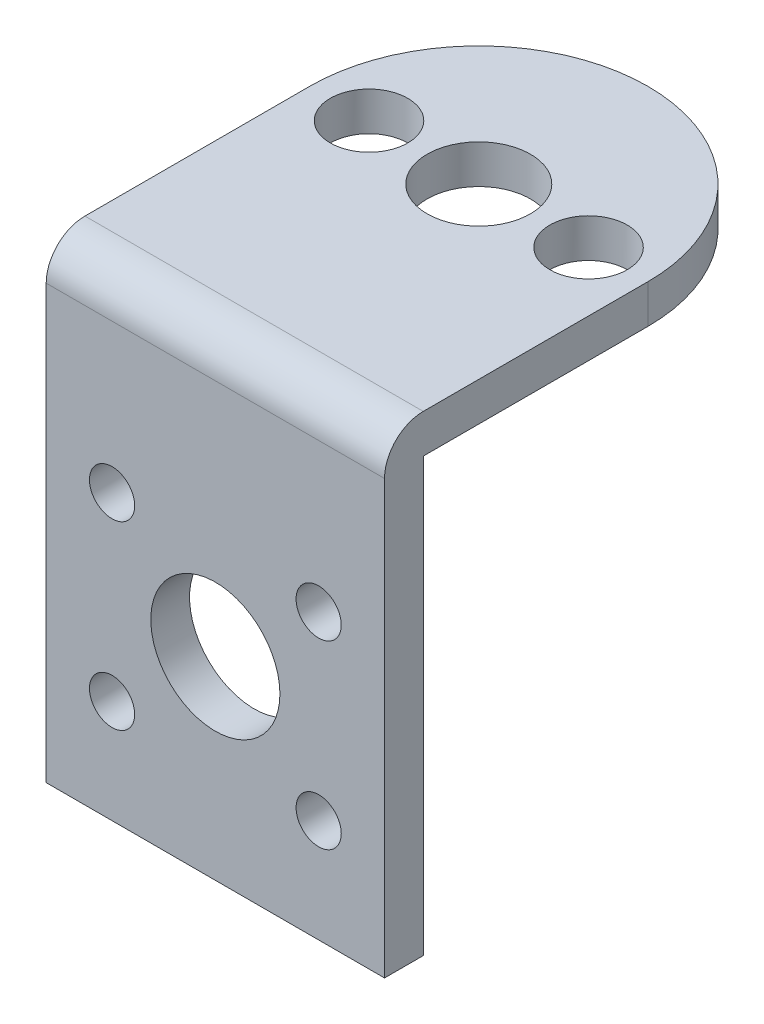
ISO-10303-21;
HEADER;
FILE_DESCRIPTION(('STEP AP214'),'2;1');
FILE_NAME('part.step','',(''),(''),'','','');
FILE_SCHEMA(('AUTOMOTIVE_DESIGN { 1 0 10303 214 1 1 1 1 }'));
ENDSEC;
DATA;
#1=APPLICATION_CONTEXT('core data for automotive mechanical design processes');
#2=APPLICATION_PROTOCOL_DEFINITION('international standard','automotive_design',2000,#1);
#3=PRODUCT_CONTEXT('',#1,'mechanical');
#4=PRODUCT('Part','Part','',(#3));
#5=PRODUCT_RELATED_PRODUCT_CATEGORY('part','',(#4));
#6=PRODUCT_DEFINITION_FORMATION('','',#4);
#7=PRODUCT_DEFINITION_CONTEXT('part definition',#1,'design');
#8=PRODUCT_DEFINITION('design','',#6,#7);
#9=PRODUCT_DEFINITION_SHAPE('','',#8);
#10=(LENGTH_UNIT() NAMED_UNIT(*) SI_UNIT(.MILLI.,.METRE.));
#11=(NAMED_UNIT(*) PLANE_ANGLE_UNIT() SI_UNIT($,.RADIAN.));
#12=(NAMED_UNIT(*) SI_UNIT($,.STERADIAN.) SOLID_ANGLE_UNIT());
#13=UNCERTAINTY_MEASURE_WITH_UNIT(LENGTH_MEASURE(1.E-05),#10,'distance_accuracy_value','');
#14=(GEOMETRIC_REPRESENTATION_CONTEXT(3) GLOBAL_UNCERTAINTY_ASSIGNED_CONTEXT((#13)) GLOBAL_UNIT_ASSIGNED_CONTEXT((#10,
#11,#12)) REPRESENTATION_CONTEXT('',''));
#15=CARTESIAN_POINT('',(0.,0.,0.));
#16=DIRECTION('',(0.,0.,1.));
#17=DIRECTION('',(1.,0.,0.));
#18=AXIS2_PLACEMENT_3D('',#15,#16,#17);
#19=CARTESIAN_POINT('',(0.,-3.,-20.4));
#20=DIRECTION('',(0.,-1.,0.));
#21=DIRECTION('',(0.,0.,-1.));
#22=AXIS2_PLACEMENT_3D('',#19,#20,#21);
#23=PLANE('',#22);
#24=CARTESIAN_POINT('',(-8.5,-3.,-20.4));
#25=DIRECTION('',(0.,-1.,0.));
#26=DIRECTION('',(0.,0.,-1.));
#27=AXIS2_PLACEMENT_3D('',#24,#25,#26);
#28=CIRCLE('',#27,3.);
#29=CARTESIAN_POINT('',(-8.5,-3.,-23.4));
#30=VERTEX_POINT('',#29);
#31=EDGE_CURVE('E338',#30,#30,#28,.F.);
#32=ORIENTED_EDGE('',*,*,#31,.T.);
#33=EDGE_LOOP('',(#32));
#34=FACE_BOUND('',#33,.T.);
#35=CARTESIAN_POINT('',(8.5,-3.,-20.4));
#36=DIRECTION('',(0.,-1.,0.));
#37=DIRECTION('',(0.,0.,-1.));
#38=AXIS2_PLACEMENT_3D('',#35,#36,#37);
#39=CIRCLE('',#38,3.);
#40=CARTESIAN_POINT('',(8.5,-3.,-23.4));
#41=VERTEX_POINT('',#40);
#42=EDGE_CURVE('E348',#41,#41,#39,.T.);
#43=ORIENTED_EDGE('',*,*,#42,.F.);
#44=EDGE_LOOP('',(#43));
#45=FACE_BOUND('',#44,.T.);
#46=CARTESIAN_POINT('',(0.,-3.,-20.4));
#47=DIRECTION('',(0.,1.,0.));
#48=DIRECTION('',(0.,0.,1.));
#49=AXIS2_PLACEMENT_3D('',#46,#47,#48);
#50=CIRCLE('',#49,4.);
#51=CARTESIAN_POINT('',(0.,-3.,-16.4));
#52=VERTEX_POINT('',#51);
#53=EDGE_CURVE('E132',#52,#52,#50,.T.);
#54=ORIENTED_EDGE('',*,*,#53,.T.);
#55=EDGE_LOOP('',(#54));
#56=FACE_BOUND('',#55,.T.);
#57=DIRECTION('',(0.,0.,-1.));
#58=VECTOR('',#57,1.);
#59=CARTESIAN_POINT('',(13.1,-3.,0.));
#60=LINE('',#59,#58);
#61=CARTESIAN_POINT('',(13.1,-3.,-3.));
#62=VERTEX_POINT('',#61);
#63=CARTESIAN_POINT('',(13.1,-3.,-20.4));
#64=VERTEX_POINT('',#63);
#65=EDGE_CURVE('E138',#62,#64,#60,.T.);
#66=ORIENTED_EDGE('',*,*,#65,.F.);
#67=DIRECTION('',(-1.,0.,0.));
#68=VECTOR('',#67,1.);
#69=CARTESIAN_POINT('',(-13.1,-3.,-3.));
#70=LINE('',#69,#68);
#71=CARTESIAN_POINT('',(-13.1,-3.,-3.));
#72=VERTEX_POINT('',#71);
#73=EDGE_CURVE('E122',#62,#72,#70,.T.);
#74=ORIENTED_EDGE('',*,*,#73,.T.);
#75=DIRECTION('',(0.,0.,1.));
#76=VECTOR('',#75,1.);
#77=CARTESIAN_POINT('',(-13.1,-3.,0.));
#78=LINE('',#77,#76);
#79=CARTESIAN_POINT('',(-13.1,-3.,-20.4));
#80=VERTEX_POINT('',#79);
#81=EDGE_CURVE('E121',#80,#72,#78,.T.);
#82=ORIENTED_EDGE('',*,*,#81,.F.);
#83=CARTESIAN_POINT('',(0.,-3.,-20.4));
#84=DIRECTION('',(0.,1.,0.));
#85=DIRECTION('',(0.,0.,-1.));
#86=AXIS2_PLACEMENT_3D('',#83,#84,#85);
#87=CIRCLE('',#86,13.1);
#88=EDGE_CURVE('E140',#64,#80,#87,.T.);
#89=ORIENTED_EDGE('',*,*,#88,.F.);
#90=EDGE_LOOP('',(#66,#74,#82,#89));
#91=FACE_BOUND('',#90,.T.);
#92=ADVANCED_FACE('F41',(#34,#45,#56,#91),#23,.T.);
#93=CARTESIAN_POINT('',(0.,-3.,0.));
#94=DIRECTION('',(0.,0.,1.));
#95=DIRECTION('',(1.,0.,0.));
#96=AXIS2_PLACEMENT_3D('',#93,#94,#95);
#97=PLANE('',#96);
#98=DIRECTION('',(0.,1.,0.));
#99=VECTOR('',#98,1.);
#100=CARTESIAN_POINT('',(13.1,-3.,0.));
#101=LINE('',#100,#99);
#102=CARTESIAN_POINT('',(13.1,-36.5,0.));
#103=VERTEX_POINT('',#102);
#104=CARTESIAN_POINT('',(13.1,-3.,0.));
#105=VERTEX_POINT('',#104);
#106=EDGE_CURVE('E145',#103,#105,#101,.T.);
#107=ORIENTED_EDGE('',*,*,#106,.T.);
#108=DIRECTION('',(1.,0.,0.));
#109=VECTOR('',#108,1.);
#110=CARTESIAN_POINT('',(-13.1,-3.,0.));
#111=LINE('',#110,#109);
#112=CARTESIAN_POINT('',(-13.1,-3.,0.));
#113=VERTEX_POINT('',#112);
#114=EDGE_CURVE('E49',#105,#113,#111,.F.);
#115=ORIENTED_EDGE('',*,*,#114,.T.);
#116=DIRECTION('',(0.,1.,0.));
#117=VECTOR('',#116,1.);
#118=CARTESIAN_POINT('',(-13.1,-3.,0.));
#119=LINE('',#118,#117);
#120=CARTESIAN_POINT('',(-13.1,-36.5,0.));
#121=VERTEX_POINT('',#120);
#122=EDGE_CURVE('E152',#121,#113,#119,.T.);
#123=ORIENTED_EDGE('',*,*,#122,.F.);
#124=DIRECTION('',(1.,0.,0.));
#125=VECTOR('',#124,1.);
#126=CARTESIAN_POINT('',(13.1,-36.5,0.));
#127=LINE('',#126,#125);
#128=EDGE_CURVE('E106',#121,#103,#127,.T.);
#129=ORIENTED_EDGE('',*,*,#128,.T.);
#130=EDGE_LOOP('',(#107,#115,#123,#129));
#131=FACE_BOUND('',#130,.T.);
#132=CARTESIAN_POINT('',(-8.,-28.5,0.));
#133=DIRECTION('',(0.,0.,1.));
#134=DIRECTION('',(-1.,0.,0.));
#135=AXIS2_PLACEMENT_3D('',#132,#133,#134);
#136=CIRCLE('',#135,1.75);
#137=CARTESIAN_POINT('',(-9.75,-28.5,0.));
#138=VERTEX_POINT('',#137);
#139=EDGE_CURVE('E351',#138,#138,#136,.T.);
#140=ORIENTED_EDGE('',*,*,#139,.F.);
#141=EDGE_LOOP('',(#140));
#142=FACE_BOUND('',#141,.T.);
#143=CARTESIAN_POINT('',(8.,-14.5,0.));
#144=DIRECTION('',(0.,0.,1.));
#145=DIRECTION('',(1.,0.,0.));
#146=AXIS2_PLACEMENT_3D('',#143,#144,#145);
#147=CIRCLE('',#146,1.75);
#148=CARTESIAN_POINT('',(9.75,-14.5,0.));
#149=VERTEX_POINT('',#148);
#150=EDGE_CURVE('E355',#149,#149,#147,.T.);
#151=ORIENTED_EDGE('',*,*,#150,.F.);
#152=EDGE_LOOP('',(#151));
#153=FACE_BOUND('',#152,.T.);
#154=CARTESIAN_POINT('',(8.,-28.5,0.));
#155=DIRECTION('',(0.,0.,1.));
#156=DIRECTION('',(1.,0.,0.));
#157=AXIS2_PLACEMENT_3D('',#154,#155,#156);
#158=CIRCLE('',#157,1.75);
#159=CARTESIAN_POINT('',(9.75,-28.5,0.));
#160=VERTEX_POINT('',#159);
#161=EDGE_CURVE('E361',#160,#160,#158,.T.);
#162=ORIENTED_EDGE('',*,*,#161,.F.);
#163=EDGE_LOOP('',(#162));
#164=FACE_BOUND('',#163,.T.);
#165=CARTESIAN_POINT('',(0.,-21.5,0.));
#166=DIRECTION('',(0.,0.,1.));
#167=DIRECTION('',(1.,0.,0.));
#168=AXIS2_PLACEMENT_3D('',#165,#166,#167);
#169=CIRCLE('',#168,5.);
#170=CARTESIAN_POINT('',(5.,-21.5,0.));
#171=VERTEX_POINT('',#170);
#172=EDGE_CURVE('E367',#171,#171,#169,.T.);
#173=ORIENTED_EDGE('',*,*,#172,.F.);
#174=EDGE_LOOP('',(#173));
#175=FACE_BOUND('',#174,.T.);
#176=CARTESIAN_POINT('',(-8.,-14.5,0.));
#177=DIRECTION('',(0.,0.,1.));
#178=DIRECTION('',(-1.,0.,0.));
#179=AXIS2_PLACEMENT_3D('',#176,#177,#178);
#180=CIRCLE('',#179,1.75);
#181=CARTESIAN_POINT('',(-9.75,-14.5,0.));
#182=VERTEX_POINT('',#181);
#183=EDGE_CURVE('E373',#182,#182,#180,.T.);
#184=ORIENTED_EDGE('',*,*,#183,.F.);
#185=EDGE_LOOP('',(#184));
#186=FACE_BOUND('',#185,.T.);
#187=ADVANCED_FACE('F191',(#131,#142,#153,#164,#175,#186),#97,.T.);
#188=CARTESIAN_POINT('',(-13.1,-3.,0.));
#189=DIRECTION('',(-1.,0.,0.));
#190=DIRECTION('',(0.,0.,1.));
#191=AXIS2_PLACEMENT_3D('',#188,#189,#190);
#192=PLANE('',#191);
#193=ORIENTED_EDGE('',*,*,#122,.T.);
#194=CARTESIAN_POINT('',(-13.1,-3.,-3.));
#195=DIRECTION('',(-1.,0.,0.));
#196=DIRECTION('',(0.,0.,1.));
#197=AXIS2_PLACEMENT_3D('',#194,#195,#196);
#198=CIRCLE('',#197,3.);
#199=CARTESIAN_POINT('',(-13.1,0.,-3.));
#200=VERTEX_POINT('',#199);
#201=EDGE_CURVE('E11',#113,#200,#198,.T.);
#202=ORIENTED_EDGE('',*,*,#201,.T.);
#203=DIRECTION('',(0.,0.,1.));
#204=VECTOR('',#203,1.);
#205=CARTESIAN_POINT('',(-13.1,0.,0.));
#206=LINE('',#205,#204);
#207=CARTESIAN_POINT('',(-13.1,0.,-20.4));
#208=VERTEX_POINT('',#207);
#209=EDGE_CURVE('E141',#208,#200,#206,.T.);
#210=ORIENTED_EDGE('',*,*,#209,.F.);
#211=DIRECTION('',(0.,1.,0.));
#212=VECTOR('',#211,1.);
#213=CARTESIAN_POINT('',(-13.1,-3.,-20.4));
#214=LINE('',#213,#212);
#215=EDGE_CURVE('E155',#80,#208,#214,.T.);
#216=ORIENTED_EDGE('',*,*,#215,.F.);
#217=ORIENTED_EDGE('',*,*,#81,.T.);
#218=DIRECTION('',(0.,-1.,0.));
#219=VECTOR('',#218,1.);
#220=CARTESIAN_POINT('',(-13.1,-36.5,-3.));
#221=LINE('',#220,#219);
#222=CARTESIAN_POINT('',(-13.1,-36.5,-3.));
#223=VERTEX_POINT('',#222);
#224=EDGE_CURVE('E114',#72,#223,#221,.T.);
#225=ORIENTED_EDGE('',*,*,#224,.T.);
#226=DIRECTION('',(0.,0.,1.));
#227=VECTOR('',#226,1.);
#228=CARTESIAN_POINT('',(-13.1,-36.5,-3.));
#229=LINE('',#228,#227);
#230=EDGE_CURVE('E99',#223,#121,#229,.T.);
#231=ORIENTED_EDGE('',*,*,#230,.T.);
#232=EDGE_LOOP('',(#193,#202,#210,#216,#217,#225,#231));
#233=FACE_BOUND('',#232,.T.);
#234=ADVANCED_FACE('F119',(#233),#192,.T.);
#235=CARTESIAN_POINT('',(0.,-3.,-20.4));
#236=DIRECTION('',(0.,1.,0.));
#237=DIRECTION('',(0.,0.,1.));
#238=AXIS2_PLACEMENT_3D('',#235,#236,#237);
#239=CYLINDRICAL_SURFACE('',#238,13.1);
#240=CARTESIAN_POINT('',(0.,0.,-20.4));
#241=DIRECTION('',(0.,1.,0.));
#242=DIRECTION('',(0.,0.,-1.));
#243=AXIS2_PLACEMENT_3D('',#240,#241,#242);
#244=CIRCLE('',#243,13.1);
#245=CARTESIAN_POINT('',(13.1,0.,-20.4));
#246=VERTEX_POINT('',#245);
#247=EDGE_CURVE('E147',#246,#208,#244,.T.);
#248=ORIENTED_EDGE('',*,*,#247,.F.);
#249=DIRECTION('',(0.,1.,0.));
#250=VECTOR('',#249,1.);
#251=CARTESIAN_POINT('',(13.1,-3.,-20.4));
#252=LINE('',#251,#250);
#253=EDGE_CURVE('E157',#64,#246,#252,.T.);
#254=ORIENTED_EDGE('',*,*,#253,.F.);
#255=ORIENTED_EDGE('',*,*,#88,.T.);
#256=ORIENTED_EDGE('',*,*,#215,.T.);
#257=EDGE_LOOP('',(#248,#254,#255,#256));
#258=FACE_BOUND('',#257,.T.);
#259=ADVANCED_FACE('F175',(#258),#239,.T.);
#260=CARTESIAN_POINT('',(13.1,-3.,0.));
#261=DIRECTION('',(1.,0.,0.));
#262=DIRECTION('',(0.,0.,-1.));
#263=AXIS2_PLACEMENT_3D('',#260,#261,#262);
#264=PLANE('',#263);
#265=DIRECTION('',(0.,0.,-1.));
#266=VECTOR('',#265,1.);
#267=CARTESIAN_POINT('',(13.1,0.,0.));
#268=LINE('',#267,#266);
#269=CARTESIAN_POINT('',(13.1,0.,-3.));
#270=VERTEX_POINT('',#269);
#271=EDGE_CURVE('E135',#270,#246,#268,.T.);
#272=ORIENTED_EDGE('',*,*,#271,.F.);
#273=CARTESIAN_POINT('',(13.1,-3.,-3.));
#274=DIRECTION('',(1.,0.,0.));
#275=DIRECTION('',(0.,0.,-1.));
#276=AXIS2_PLACEMENT_3D('',#273,#274,#275);
#277=CIRCLE('',#276,3.);
#278=EDGE_CURVE('E63',#270,#105,#277,.T.);
#279=ORIENTED_EDGE('',*,*,#278,.T.);
#280=ORIENTED_EDGE('',*,*,#106,.F.);
#281=DIRECTION('',(0.,0.,1.));
#282=VECTOR('',#281,1.);
#283=CARTESIAN_POINT('',(13.1,-36.5,-3.));
#284=LINE('',#283,#282);
#285=CARTESIAN_POINT('',(13.1,-36.5,-3.));
#286=VERTEX_POINT('',#285);
#287=EDGE_CURVE('E109',#286,#103,#284,.T.);
#288=ORIENTED_EDGE('',*,*,#287,.F.);
#289=DIRECTION('',(0.,1.,0.));
#290=VECTOR('',#289,1.);
#291=CARTESIAN_POINT('',(13.1,-3.,-3.));
#292=LINE('',#291,#290);
#293=EDGE_CURVE('E110',#286,#62,#292,.T.);
#294=ORIENTED_EDGE('',*,*,#293,.T.);
#295=ORIENTED_EDGE('',*,*,#65,.T.);
#296=ORIENTED_EDGE('',*,*,#253,.T.);
#297=EDGE_LOOP('',(#272,#279,#280,#288,#294,#295,#296));
#298=FACE_BOUND('',#297,.T.);
#299=ADVANCED_FACE('F169',(#298),#264,.T.);
#300=CARTESIAN_POINT('',(0.,0.,-20.4));
#301=DIRECTION('',(0.,-1.,0.));
#302=DIRECTION('',(0.,0.,-1.));
#303=AXIS2_PLACEMENT_3D('',#300,#301,#302);
#304=PLANE('',#303);
#305=CARTESIAN_POINT('',(-8.5,0.,-20.4));
#306=DIRECTION('',(0.,-1.,0.));
#307=DIRECTION('',(0.,0.,1.));
#308=AXIS2_PLACEMENT_3D('',#305,#306,#307);
#309=CIRCLE('',#308,3.);
#310=CARTESIAN_POINT('',(-8.5,0.,-17.4));
#311=VERTEX_POINT('',#310);
#312=EDGE_CURVE('E341',#311,#311,#309,.T.);
#313=ORIENTED_EDGE('',*,*,#312,.T.);
#314=EDGE_LOOP('',(#313));
#315=FACE_BOUND('',#314,.T.);
#316=CARTESIAN_POINT('',(8.5,0.,-20.4));
#317=DIRECTION('',(0.,1.,0.));
#318=DIRECTION('',(0.,0.,1.));
#319=AXIS2_PLACEMENT_3D('',#316,#317,#318);
#320=CIRCLE('',#319,3.);
#321=CARTESIAN_POINT('',(8.5,0.,-17.4));
#322=VERTEX_POINT('',#321);
#323=EDGE_CURVE('E343',#322,#322,#320,.T.);
#324=ORIENTED_EDGE('',*,*,#323,.F.);
#325=EDGE_LOOP('',(#324));
#326=FACE_BOUND('',#325,.T.);
#327=CARTESIAN_POINT('',(0.,0.,-20.4));
#328=DIRECTION('',(0.,1.,0.));
#329=DIRECTION('',(0.,0.,1.));
#330=AXIS2_PLACEMENT_3D('',#327,#328,#329);
#331=CIRCLE('',#330,4.);
#332=CARTESIAN_POINT('',(0.,0.,-16.4));
#333=VERTEX_POINT('',#332);
#334=EDGE_CURVE('E130',#333,#333,#331,.T.);
#335=ORIENTED_EDGE('',*,*,#334,.F.);
#336=EDGE_LOOP('',(#335));
#337=FACE_BOUND('',#336,.T.);
#338=ORIENTED_EDGE('',*,*,#209,.T.);
#339=DIRECTION('',(1.,0.,0.));
#340=VECTOR('',#339,1.);
#341=CARTESIAN_POINT('',(13.1,0.,-3.));
#342=LINE('',#341,#340);
#343=EDGE_CURVE('E154',#200,#270,#342,.T.);
#344=ORIENTED_EDGE('',*,*,#343,.T.);
#345=ORIENTED_EDGE('',*,*,#271,.T.);
#346=ORIENTED_EDGE('',*,*,#247,.T.);
#347=EDGE_LOOP('',(#338,#344,#345,#346));
#348=FACE_BOUND('',#347,.T.);
#349=ADVANCED_FACE('F165',(#315,#326,#337,#348),#304,.F.);
#350=CARTESIAN_POINT('',(0.,-3.,-20.4));
#351=DIRECTION('',(0.,1.,0.));
#352=DIRECTION('',(0.,0.,1.));
#353=AXIS2_PLACEMENT_3D('',#350,#351,#352);
#354=CYLINDRICAL_SURFACE('',#353,4.);
#355=ORIENTED_EDGE('',*,*,#53,.F.);
#356=EDGE_LOOP('',(#355));
#357=FACE_BOUND('',#356,.T.);
#358=ORIENTED_EDGE('',*,*,#334,.T.);
#359=EDGE_LOOP('',(#358));
#360=FACE_BOUND('',#359,.T.);
#361=ADVANCED_FACE('F203',(#357,#360),#354,.F.);
#362=CARTESIAN_POINT('',(13.1,-36.5,-3.));
#363=DIRECTION('',(0.,-1.,0.));
#364=DIRECTION('',(0.,0.,-1.));
#365=AXIS2_PLACEMENT_3D('',#362,#363,#364);
#366=PLANE('',#365);
#367=ORIENTED_EDGE('',*,*,#128,.F.);
#368=ORIENTED_EDGE('',*,*,#230,.F.);
#369=DIRECTION('',(1.,0.,0.));
#370=VECTOR('',#369,1.);
#371=CARTESIAN_POINT('',(13.1,-36.5,-3.));
#372=LINE('',#371,#370);
#373=EDGE_CURVE('E103',#223,#286,#372,.T.);
#374=ORIENTED_EDGE('',*,*,#373,.T.);
#375=ORIENTED_EDGE('',*,*,#287,.T.);
#376=EDGE_LOOP('',(#367,#368,#374,#375));
#377=FACE_BOUND('',#376,.T.);
#378=ADVANCED_FACE('F101',(#377),#366,.T.);
#379=CARTESIAN_POINT('',(0.,0.,-3.));
#380=DIRECTION('',(0.,0.,-1.));
#381=DIRECTION('',(-1.,0.,0.));
#382=AXIS2_PLACEMENT_3D('',#379,#380,#381);
#383=PLANE('',#382);
#384=CARTESIAN_POINT('',(-8.,-28.5,-3.));
#385=DIRECTION('',(0.,0.,1.));
#386=DIRECTION('',(-1.,0.,0.));
#387=AXIS2_PLACEMENT_3D('',#384,#385,#386);
#388=CIRCLE('',#387,1.75);
#389=CARTESIAN_POINT('',(-9.75,-28.5,-3.));
#390=VERTEX_POINT('',#389);
#391=EDGE_CURVE('E352',#390,#390,#388,.T.);
#392=ORIENTED_EDGE('',*,*,#391,.T.);
#393=EDGE_LOOP('',(#392));
#394=FACE_BOUND('',#393,.T.);
#395=CARTESIAN_POINT('',(8.,-14.5,-3.));
#396=DIRECTION('',(0.,0.,1.));
#397=DIRECTION('',(1.,0.,0.));
#398=AXIS2_PLACEMENT_3D('',#395,#396,#397);
#399=CIRCLE('',#398,1.75);
#400=CARTESIAN_POINT('',(9.75,-14.5,-3.));
#401=VERTEX_POINT('',#400);
#402=EDGE_CURVE('E358',#401,#401,#399,.T.);
#403=ORIENTED_EDGE('',*,*,#402,.T.);
#404=EDGE_LOOP('',(#403));
#405=FACE_BOUND('',#404,.T.);
#406=CARTESIAN_POINT('',(8.,-28.5,-3.));
#407=DIRECTION('',(0.,0.,1.));
#408=DIRECTION('',(1.,0.,0.));
#409=AXIS2_PLACEMENT_3D('',#406,#407,#408);
#410=CIRCLE('',#409,1.75);
#411=CARTESIAN_POINT('',(9.75,-28.5,-3.));
#412=VERTEX_POINT('',#411);
#413=EDGE_CURVE('E364',#412,#412,#410,.T.);
#414=ORIENTED_EDGE('',*,*,#413,.T.);
#415=EDGE_LOOP('',(#414));
#416=FACE_BOUND('',#415,.T.);
#417=CARTESIAN_POINT('',(0.,-21.5,-3.));
#418=DIRECTION('',(0.,0.,1.));
#419=DIRECTION('',(1.,0.,0.));
#420=AXIS2_PLACEMENT_3D('',#417,#418,#419);
#421=CIRCLE('',#420,5.);
#422=CARTESIAN_POINT('',(5.,-21.5,-3.));
#423=VERTEX_POINT('',#422);
#424=EDGE_CURVE('E370',#423,#423,#421,.T.);
#425=ORIENTED_EDGE('',*,*,#424,.T.);
#426=EDGE_LOOP('',(#425));
#427=FACE_BOUND('',#426,.T.);
#428=CARTESIAN_POINT('',(-8.,-14.5,-3.));
#429=DIRECTION('',(0.,0.,1.));
#430=DIRECTION('',(-1.,0.,0.));
#431=AXIS2_PLACEMENT_3D('',#428,#429,#430);
#432=CIRCLE('',#431,1.75);
#433=CARTESIAN_POINT('',(-9.75,-14.5,-3.));
#434=VERTEX_POINT('',#433);
#435=EDGE_CURVE('E129',#434,#434,#432,.T.);
#436=ORIENTED_EDGE('',*,*,#435,.T.);
#437=EDGE_LOOP('',(#436));
#438=FACE_BOUND('',#437,.T.);
#439=ORIENTED_EDGE('',*,*,#73,.F.);
#440=ORIENTED_EDGE('',*,*,#293,.F.);
#441=ORIENTED_EDGE('',*,*,#373,.F.);
#442=ORIENTED_EDGE('',*,*,#224,.F.);
#443=EDGE_LOOP('',(#439,#440,#441,#442));
#444=FACE_BOUND('',#443,.T.);
#445=ADVANCED_FACE('F113',(#394,#405,#416,#427,#438,#444),#383,.T.);
#446=CARTESIAN_POINT('',(-8.,-14.5,-3.));
#447=DIRECTION('',(0.,0.,1.));
#448=DIRECTION('',(1.,0.,0.));
#449=AXIS2_PLACEMENT_3D('',#446,#447,#448);
#450=CYLINDRICAL_SURFACE('',#449,1.75);
#451=ORIENTED_EDGE('',*,*,#435,.F.);
#452=EDGE_LOOP('',(#451));
#453=FACE_BOUND('',#452,.T.);
#454=ORIENTED_EDGE('',*,*,#183,.T.);
#455=EDGE_LOOP('',(#454));
#456=FACE_BOUND('',#455,.T.);
#457=ADVANCED_FACE('F254',(#453,#456),#450,.F.);
#458=CARTESIAN_POINT('',(0.,-21.5,-3.));
#459=DIRECTION('',(0.,0.,1.));
#460=DIRECTION('',(1.,0.,0.));
#461=AXIS2_PLACEMENT_3D('',#458,#459,#460);
#462=CYLINDRICAL_SURFACE('',#461,5.);
#463=ORIENTED_EDGE('',*,*,#424,.F.);
#464=EDGE_LOOP('',(#463));
#465=FACE_BOUND('',#464,.T.);
#466=ORIENTED_EDGE('',*,*,#172,.T.);
#467=EDGE_LOOP('',(#466));
#468=FACE_BOUND('',#467,.T.);
#469=ADVANCED_FACE('F245',(#465,#468),#462,.F.);
#470=CARTESIAN_POINT('',(8.,-28.5,-3.));
#471=DIRECTION('',(0.,0.,1.));
#472=DIRECTION('',(1.,0.,0.));
#473=AXIS2_PLACEMENT_3D('',#470,#471,#472);
#474=CYLINDRICAL_SURFACE('',#473,1.75);
#475=ORIENTED_EDGE('',*,*,#413,.F.);
#476=EDGE_LOOP('',(#475));
#477=FACE_BOUND('',#476,.T.);
#478=ORIENTED_EDGE('',*,*,#161,.T.);
#479=EDGE_LOOP('',(#478));
#480=FACE_BOUND('',#479,.T.);
#481=ADVANCED_FACE('F236',(#477,#480),#474,.F.);
#482=CARTESIAN_POINT('',(8.,-14.5,-3.));
#483=DIRECTION('',(0.,0.,1.));
#484=DIRECTION('',(1.,0.,0.));
#485=AXIS2_PLACEMENT_3D('',#482,#483,#484);
#486=CYLINDRICAL_SURFACE('',#485,1.75);
#487=ORIENTED_EDGE('',*,*,#402,.F.);
#488=EDGE_LOOP('',(#487));
#489=FACE_BOUND('',#488,.T.);
#490=ORIENTED_EDGE('',*,*,#150,.T.);
#491=EDGE_LOOP('',(#490));
#492=FACE_BOUND('',#491,.T.);
#493=ADVANCED_FACE('F187',(#489,#492),#486,.F.);
#494=CARTESIAN_POINT('',(-8.,-28.5,-3.));
#495=DIRECTION('',(0.,0.,1.));
#496=DIRECTION('',(1.,0.,0.));
#497=AXIS2_PLACEMENT_3D('',#494,#495,#496);
#498=CYLINDRICAL_SURFACE('',#497,1.75);
#499=ORIENTED_EDGE('',*,*,#391,.F.);
#500=EDGE_LOOP('',(#499));
#501=FACE_BOUND('',#500,.T.);
#502=ORIENTED_EDGE('',*,*,#139,.T.);
#503=EDGE_LOOP('',(#502));
#504=FACE_BOUND('',#503,.T.);
#505=ADVANCED_FACE('F178',(#501,#504),#498,.F.);
#506=CARTESIAN_POINT('',(0.,-3.,-3.));
#507=DIRECTION('',(-1.,0.,0.));
#508=DIRECTION('',(0.,0.,1.));
#509=AXIS2_PLACEMENT_3D('',#506,#507,#508);
#510=CYLINDRICAL_SURFACE('',#509,3.);
#511=ORIENTED_EDGE('',*,*,#201,.F.);
#512=ORIENTED_EDGE('',*,*,#114,.F.);
#513=ORIENTED_EDGE('',*,*,#278,.F.);
#514=ORIENTED_EDGE('',*,*,#343,.F.);
#515=EDGE_LOOP('',(#511,#512,#513,#514));
#516=FACE_BOUND('',#515,.T.);
#517=ADVANCED_FACE('F43',(#516),#510,.T.);
#518=CARTESIAN_POINT('',(8.5,-36.5,-20.4));
#519=DIRECTION('',(0.,1.,0.));
#520=DIRECTION('',(0.,0.,1.));
#521=AXIS2_PLACEMENT_3D('',#518,#519,#520);
#522=CYLINDRICAL_SURFACE('',#521,3.);
#523=ORIENTED_EDGE('',*,*,#42,.T.);
#524=EDGE_LOOP('',(#523));
#525=FACE_BOUND('',#524,.T.);
#526=ORIENTED_EDGE('',*,*,#323,.T.);
#527=EDGE_LOOP('',(#526));
#528=FACE_BOUND('',#527,.T.);
#529=ADVANCED_FACE('F177',(#525,#528),#522,.F.);
#530=CARTESIAN_POINT('',(-8.5,-36.5,-20.4));
#531=DIRECTION('',(0.,1.,0.));
#532=DIRECTION('',(0.,0.,1.));
#533=AXIS2_PLACEMENT_3D('',#530,#531,#532);
#534=CYLINDRICAL_SURFACE('',#533,3.);
#535=ORIENTED_EDGE('',*,*,#31,.F.);
#536=EDGE_LOOP('',(#535));
#537=FACE_BOUND('',#536,.T.);
#538=ORIENTED_EDGE('',*,*,#312,.F.);
#539=EDGE_LOOP('',(#538));
#540=FACE_BOUND('',#539,.T.);
#541=ADVANCED_FACE('F183',(#537,#540),#534,.F.);
#542=CLOSED_SHELL('',(#92,#187,#234,#259,#299,#349,#361,#378,#445,#457,#469,#481,#493,#505,#517,
#529,#541));
#543=MANIFOLD_SOLID_BREP('B2',#542);
#544=ADVANCED_BREP_SHAPE_REPRESENTATION('',(#18,#543),#14);
#545=SHAPE_DEFINITION_REPRESENTATION(#9,#544);
ENDSEC;
END-ISO-10303-21;
